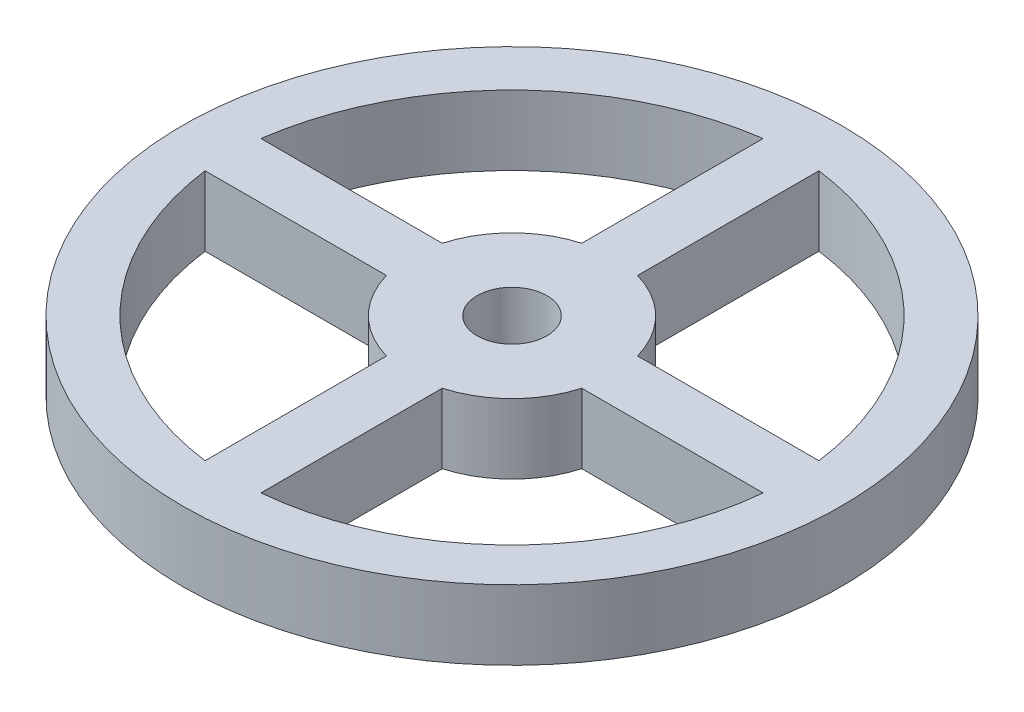
ISO-10303-21;
HEADER;
FILE_DESCRIPTION(('STEP AP214'),'2;1');
FILE_NAME('part.step','',(''),(''),'','','');
FILE_SCHEMA(('AUTOMOTIVE_DESIGN { 1 0 10303 214 1 1 1 1 }'));
ENDSEC;
DATA;
#1=APPLICATION_CONTEXT('core data for automotive mechanical design processes');
#2=APPLICATION_PROTOCOL_DEFINITION('international standard','automotive_design',2000,#1);
#3=PRODUCT_CONTEXT('',#1,'mechanical');
#4=PRODUCT('Part','Part','',(#3));
#5=PRODUCT_RELATED_PRODUCT_CATEGORY('part','',(#4));
#6=PRODUCT_DEFINITION_FORMATION('','',#4);
#7=PRODUCT_DEFINITION_CONTEXT('part definition',#1,'design');
#8=PRODUCT_DEFINITION('design','',#6,#7);
#9=PRODUCT_DEFINITION_SHAPE('','',#8);
#10=(LENGTH_UNIT() NAMED_UNIT(*) SI_UNIT(.MILLI.,.METRE.));
#11=(NAMED_UNIT(*) PLANE_ANGLE_UNIT() SI_UNIT($,.RADIAN.));
#12=(NAMED_UNIT(*) SI_UNIT($,.STERADIAN.) SOLID_ANGLE_UNIT());
#13=UNCERTAINTY_MEASURE_WITH_UNIT(LENGTH_MEASURE(1.E-05),#10,'distance_accuracy_value','');
#14=(GEOMETRIC_REPRESENTATION_CONTEXT(3) GLOBAL_UNCERTAINTY_ASSIGNED_CONTEXT((#13)) GLOBAL_UNIT_ASSIGNED_CONTEXT((#10,
#11,#12)) REPRESENTATION_CONTEXT('',''));
#15=CARTESIAN_POINT('',(0.,0.,0.));
#16=DIRECTION('',(0.,0.,1.));
#17=DIRECTION('',(1.,0.,0.));
#18=AXIS2_PLACEMENT_3D('',#15,#16,#17);
#19=CARTESIAN_POINT('',(0.,6.35,0.));
#20=DIRECTION('',(0.,-1.,0.));
#21=DIRECTION('',(0.,0.,-1.));
#22=AXIS2_PLACEMENT_3D('',#19,#20,#21);
#23=CYLINDRICAL_SURFACE('',#22,30.);
#24=CARTESIAN_POINT('',(0.,6.35,0.));
#25=DIRECTION('',(0.,1.,0.));
#26=DIRECTION('',(0.,0.,1.));
#27=AXIS2_PLACEMENT_3D('',#24,#25,#26);
#28=CIRCLE('',#27,30.);
#29=CARTESIAN_POINT('',(0.,6.35,30.));
#30=VERTEX_POINT('',#29);
#31=EDGE_CURVE('E11',#30,#30,#28,.T.);
#32=ORIENTED_EDGE('',*,*,#31,.F.);
#33=EDGE_LOOP('',(#32));
#34=FACE_BOUND('',#33,.T.);
#35=CARTESIAN_POINT('',(0.,0.,0.));
#36=DIRECTION('',(0.,1.,0.));
#37=DIRECTION('',(0.,0.,1.));
#38=AXIS2_PLACEMENT_3D('',#35,#36,#37);
#39=CIRCLE('',#38,30.);
#40=CARTESIAN_POINT('',(0.,0.,30.));
#41=VERTEX_POINT('',#40);
#42=EDGE_CURVE('E36',#41,#41,#39,.T.);
#43=ORIENTED_EDGE('',*,*,#42,.T.);
#44=EDGE_LOOP('',(#43));
#45=FACE_BOUND('',#44,.T.);
#46=ADVANCED_FACE('F33',(#34,#45),#23,.T.);
#47=CARTESIAN_POINT('',(0.,6.35,0.));
#48=DIRECTION('',(0.,1.,0.));
#49=DIRECTION('',(0.,0.,1.));
#50=AXIS2_PLACEMENT_3D('',#47,#48,#49);
#51=PLANE('',#50);
#52=CARTESIAN_POINT('',(-1.76941794549634E-13,6.35,1.76074432811646E-13));
#53=DIRECTION('',(0.,-1.,0.));
#54=DIRECTION('',(0.,0.,-1.));
#55=AXIS2_PLACEMENT_3D('',#52,#53,#54);
#56=CIRCLE('',#55,9.24573955938648);
#57=CARTESIAN_POINT('',(2.54,6.35,-8.89));
#58=VERTEX_POINT('',#57);
#59=CARTESIAN_POINT('',(8.89,6.35,-2.54));
#60=VERTEX_POINT('',#59);
#61=EDGE_CURVE('E47',#58,#60,#56,.T.);
#62=ORIENTED_EDGE('',*,*,#61,.F.);
#63=DIRECTION('',(0.,0.,1.));
#64=VECTOR('',#63,1.);
#65=CARTESIAN_POINT('',(2.54,6.35,-8.89));
#66=LINE('',#65,#64);
#67=CARTESIAN_POINT('',(2.54,6.35,-25.4));
#68=VERTEX_POINT('',#67);
#69=EDGE_CURVE('E224',#68,#58,#66,.T.);
#70=ORIENTED_EDGE('',*,*,#69,.F.);
#71=CARTESIAN_POINT('',(-0.945362098874315,6.35,0.945362098874315));
#72=DIRECTION('',(0.,1.,0.));
#73=DIRECTION('',(0.,0.,-1.));
#74=AXIS2_PLACEMENT_3D('',#71,#72,#73);
#75=CIRCLE('',#74,26.5749102177425);
#76=CARTESIAN_POINT('',(25.4,6.35,-2.54));
#77=VERTEX_POINT('',#76);
#78=EDGE_CURVE('E238',#77,#68,#75,.T.);
#79=ORIENTED_EDGE('',*,*,#78,.F.);
#80=DIRECTION('',(1.,0.,0.));
#81=VECTOR('',#80,1.);
#82=CARTESIAN_POINT('',(8.89,6.35,-2.54));
#83=LINE('',#82,#81);
#84=EDGE_CURVE('E235',#60,#77,#83,.T.);
#85=ORIENTED_EDGE('',*,*,#84,.F.);
#86=EDGE_LOOP('',(#62,#70,#79,#85));
#87=FACE_BOUND('',#86,.T.);
#88=CARTESIAN_POINT('',(0.,6.35,0.));
#89=DIRECTION('',(0.,-1.,0.));
#90=DIRECTION('',(0.,0.,-1.));
#91=AXIS2_PLACEMENT_3D('',#88,#89,#90);
#92=CIRCLE('',#91,9.2457395593863);
#93=CARTESIAN_POINT('',(-8.89,6.35,-2.54));
#94=VERTEX_POINT('',#93);
#95=CARTESIAN_POINT('',(-2.54,6.35,-8.89));
#96=VERTEX_POINT('',#95);
#97=EDGE_CURVE('E55',#94,#96,#92,.T.);
#98=ORIENTED_EDGE('',*,*,#97,.F.);
#99=DIRECTION('',(1.,0.,0.));
#100=VECTOR('',#99,1.);
#101=CARTESIAN_POINT('',(-8.89,6.35,-2.54));
#102=LINE('',#101,#100);
#103=CARTESIAN_POINT('',(-25.4,6.35,-2.54));
#104=VERTEX_POINT('',#103);
#105=EDGE_CURVE('E194',#104,#94,#102,.T.);
#106=ORIENTED_EDGE('',*,*,#105,.F.);
#107=CARTESIAN_POINT('',(1.19938539126162,6.35,1.19938539126162));
#108=DIRECTION('',(0.,1.,0.));
#109=DIRECTION('',(0.,0.,-1.));
#110=AXIS2_PLACEMENT_3D('',#107,#108,#109);
#111=CIRCLE('',#110,26.8609438832153);
#112=CARTESIAN_POINT('',(-2.54,6.35,-25.4));
#113=VERTEX_POINT('',#112);
#114=EDGE_CURVE('E209',#113,#104,#111,.T.);
#115=ORIENTED_EDGE('',*,*,#114,.F.);
#116=DIRECTION('',(0.,0.,-1.));
#117=VECTOR('',#116,1.);
#118=CARTESIAN_POINT('',(-2.54,6.35,-8.89));
#119=LINE('',#118,#117);
#120=EDGE_CURVE('E205',#96,#113,#119,.T.);
#121=ORIENTED_EDGE('',*,*,#120,.F.);
#122=EDGE_LOOP('',(#98,#106,#115,#121));
#123=FACE_BOUND('',#122,.T.);
#124=CARTESIAN_POINT('',(1.98625837999344E-13,6.35,-1.97758476261356E-13));
#125=DIRECTION('',(0.,-1.,0.));
#126=DIRECTION('',(0.,0.,-1.));
#127=AXIS2_PLACEMENT_3D('',#124,#125,#126);
#128=CIRCLE('',#127,9.2457395593865);
#129=CARTESIAN_POINT('',(-2.54,6.35,8.89));
#130=VERTEX_POINT('',#129);
#131=CARTESIAN_POINT('',(-8.89,6.35,2.54));
#132=VERTEX_POINT('',#131);
#133=EDGE_CURVE('E152',#130,#132,#128,.T.);
#134=ORIENTED_EDGE('',*,*,#133,.F.);
#135=DIRECTION('',(0.,0.,-1.));
#136=VECTOR('',#135,1.);
#137=CARTESIAN_POINT('',(-2.54,6.35,8.89));
#138=LINE('',#137,#136);
#139=CARTESIAN_POINT('',(-2.54,6.35,25.4));
#140=VERTEX_POINT('',#139);
#141=EDGE_CURVE('E170',#140,#130,#138,.T.);
#142=ORIENTED_EDGE('',*,*,#141,.F.);
#143=CARTESIAN_POINT('',(0.94536209887696,6.35,-0.94536209887696));
#144=DIRECTION('',(0.,1.,0.));
#145=DIRECTION('',(0.,0.,-1.));
#146=AXIS2_PLACEMENT_3D('',#143,#144,#145);
#147=CIRCLE('',#146,26.5749102177454);
#148=CARTESIAN_POINT('',(-25.4,6.35,2.54000000000002));
#149=VERTEX_POINT('',#148);
#150=EDGE_CURVE('E173',#149,#140,#147,.T.);
#151=ORIENTED_EDGE('',*,*,#150,.F.);
#152=DIRECTION('',(-1.,0.,0.));
#153=VECTOR('',#152,1.);
#154=CARTESIAN_POINT('',(-8.89,6.35,2.54));
#155=LINE('',#154,#153);
#156=EDGE_CURVE('E179',#132,#149,#155,.T.);
#157=ORIENTED_EDGE('',*,*,#156,.F.);
#158=EDGE_LOOP('',(#134,#142,#151,#157));
#159=FACE_BOUND('',#158,.T.);
#160=CARTESIAN_POINT('',(-2.62810606610486E-13,6.35,-2.63677968348475E-13));
#161=DIRECTION('',(0.,-1.,0.));
#162=DIRECTION('',(0.,0.,-1.));
#163=AXIS2_PLACEMENT_3D('',#160,#161,#162);
#164=CIRCLE('',#163,9.24573955938658);
#165=CARTESIAN_POINT('',(8.89,6.35,2.54));
#166=VERTEX_POINT('',#165);
#167=CARTESIAN_POINT('',(2.54,6.35,8.89));
#168=VERTEX_POINT('',#167);
#169=EDGE_CURVE('E186',#166,#168,#164,.T.);
#170=ORIENTED_EDGE('',*,*,#169,.F.);
#171=DIRECTION('',(-1.,0.,0.));
#172=VECTOR('',#171,1.);
#173=CARTESIAN_POINT('',(8.89,6.35,2.54));
#174=LINE('',#173,#172);
#175=CARTESIAN_POINT('',(25.4,6.35,2.54));
#176=VERTEX_POINT('',#175);
#177=EDGE_CURVE('E253',#176,#166,#174,.T.);
#178=ORIENTED_EDGE('',*,*,#177,.F.);
#179=CARTESIAN_POINT('',(0.115935614412643,6.35,0.115935614412643));
#180=DIRECTION('',(0.,1.,0.));
#181=DIRECTION('',(0.,0.,1.));
#182=AXIS2_PLACEMENT_3D('',#179,#180,#181);
#183=CIRCLE('',#182,25.4);
#184=CARTESIAN_POINT('',(2.54,6.35,25.4));
#185=VERTEX_POINT('',#184);
#186=EDGE_CURVE('E267',#185,#176,#183,.T.);
#187=ORIENTED_EDGE('',*,*,#186,.F.);
#188=DIRECTION('',(0.,0.,1.));
#189=VECTOR('',#188,1.);
#190=CARTESIAN_POINT('',(2.54,6.35,8.89));
#191=LINE('',#190,#189);
#192=EDGE_CURVE('E264',#168,#185,#191,.T.);
#193=ORIENTED_EDGE('',*,*,#192,.F.);
#194=EDGE_LOOP('',(#170,#178,#187,#193));
#195=FACE_BOUND('',#194,.T.);
#196=CARTESIAN_POINT('',(0.,6.35,0.));
#197=DIRECTION('',(0.,1.,0.));
#198=DIRECTION('',(0.,0.,1.));
#199=AXIS2_PLACEMENT_3D('',#196,#197,#198);
#200=CIRCLE('',#199,3.175);
#201=CARTESIAN_POINT('',(0.,6.35,3.175));
#202=VERTEX_POINT('',#201);
#203=EDGE_CURVE('E274',#202,#202,#200,.T.);
#204=ORIENTED_EDGE('',*,*,#203,.F.);
#205=EDGE_LOOP('',(#204));
#206=FACE_BOUND('',#205,.T.);
#207=ORIENTED_EDGE('',*,*,#31,.T.);
#208=EDGE_LOOP('',(#207));
#209=FACE_BOUND('',#208,.T.);
#210=ADVANCED_FACE('F289',(#87,#123,#159,#195,#206,#209),#51,.T.);
#211=CARTESIAN_POINT('',(0.,0.,0.));
#212=DIRECTION('',(0.,1.,0.));
#213=DIRECTION('',(0.,0.,1.));
#214=AXIS2_PLACEMENT_3D('',#211,#212,#213);
#215=PLANE('',#214);
#216=DIRECTION('',(0.,0.,1.));
#217=VECTOR('',#216,1.);
#218=CARTESIAN_POINT('',(2.54,0.,-8.89));
#219=LINE('',#218,#217);
#220=CARTESIAN_POINT('',(2.54,0.,-25.4));
#221=VERTEX_POINT('',#220);
#222=CARTESIAN_POINT('',(2.54,0.,-8.89));
#223=VERTEX_POINT('',#222);
#224=EDGE_CURVE('E230',#221,#223,#219,.T.);
#225=ORIENTED_EDGE('',*,*,#224,.T.);
#226=CARTESIAN_POINT('',(-1.76941794549634E-13,0.,1.76074432811646E-13));
#227=DIRECTION('',(0.,-1.,0.));
#228=DIRECTION('',(0.,0.,-1.));
#229=AXIS2_PLACEMENT_3D('',#226,#227,#228);
#230=CIRCLE('',#229,9.24573955938648);
#231=CARTESIAN_POINT('',(8.89,0.,-2.54));
#232=VERTEX_POINT('',#231);
#233=EDGE_CURVE('E220',#223,#232,#230,.T.);
#234=ORIENTED_EDGE('',*,*,#233,.T.);
#235=DIRECTION('',(1.,0.,0.));
#236=VECTOR('',#235,1.);
#237=CARTESIAN_POINT('',(8.89,0.,-2.54));
#238=LINE('',#237,#236);
#239=CARTESIAN_POINT('',(25.4,0.,-2.54));
#240=VERTEX_POINT('',#239);
#241=EDGE_CURVE('E223',#232,#240,#238,.T.);
#242=ORIENTED_EDGE('',*,*,#241,.T.);
#243=CARTESIAN_POINT('',(-0.945362098874315,0.,0.945362098874315));
#244=DIRECTION('',(0.,1.,0.));
#245=DIRECTION('',(0.,0.,-1.));
#246=AXIS2_PLACEMENT_3D('',#243,#244,#245);
#247=CIRCLE('',#246,26.5749102177425);
#248=EDGE_CURVE('E227',#240,#221,#247,.T.);
#249=ORIENTED_EDGE('',*,*,#248,.T.);
#250=EDGE_LOOP('',(#225,#234,#242,#249));
#251=FACE_BOUND('',#250,.T.);
#252=DIRECTION('',(1.,0.,0.));
#253=VECTOR('',#252,1.);
#254=CARTESIAN_POINT('',(-8.89,0.,-2.54));
#255=LINE('',#254,#253);
#256=CARTESIAN_POINT('',(-25.4,0.,-2.54));
#257=VERTEX_POINT('',#256);
#258=CARTESIAN_POINT('',(-8.89,0.,-2.54));
#259=VERTEX_POINT('',#258);
#260=EDGE_CURVE('E200',#257,#259,#255,.T.);
#261=ORIENTED_EDGE('',*,*,#260,.T.);
#262=CARTESIAN_POINT('',(0.,0.,0.));
#263=DIRECTION('',(0.,-1.,0.));
#264=DIRECTION('',(0.,0.,-1.));
#265=AXIS2_PLACEMENT_3D('',#262,#263,#264);
#266=CIRCLE('',#265,9.2457395593863);
#267=CARTESIAN_POINT('',(-2.54,0.,-8.89));
#268=VERTEX_POINT('',#267);
#269=EDGE_CURVE('E190',#259,#268,#266,.T.);
#270=ORIENTED_EDGE('',*,*,#269,.T.);
#271=DIRECTION('',(0.,0.,-1.));
#272=VECTOR('',#271,1.);
#273=CARTESIAN_POINT('',(-2.54,0.,-8.89));
#274=LINE('',#273,#272);
#275=CARTESIAN_POINT('',(-2.54,0.,-25.4));
#276=VERTEX_POINT('',#275);
#277=EDGE_CURVE('E193',#268,#276,#274,.T.);
#278=ORIENTED_EDGE('',*,*,#277,.T.);
#279=CARTESIAN_POINT('',(1.19938539126162,0.,1.19938539126162));
#280=DIRECTION('',(0.,1.,0.));
#281=DIRECTION('',(0.,0.,-1.));
#282=AXIS2_PLACEMENT_3D('',#279,#280,#281);
#283=CIRCLE('',#282,26.8609438832153);
#284=EDGE_CURVE('E197',#276,#257,#283,.T.);
#285=ORIENTED_EDGE('',*,*,#284,.T.);
#286=EDGE_LOOP('',(#261,#270,#278,#285));
#287=FACE_BOUND('',#286,.T.);
#288=DIRECTION('',(0.,0.,-1.));
#289=VECTOR('',#288,1.);
#290=CARTESIAN_POINT('',(-2.54,0.,8.89));
#291=LINE('',#290,#289);
#292=CARTESIAN_POINT('',(-2.54,0.,25.4));
#293=VERTEX_POINT('',#292);
#294=CARTESIAN_POINT('',(-2.54,0.,8.89));
#295=VERTEX_POINT('',#294);
#296=EDGE_CURVE('E157',#293,#295,#291,.T.);
#297=ORIENTED_EDGE('',*,*,#296,.T.);
#298=CARTESIAN_POINT('',(1.98625837999344E-13,0.,-1.97758476261356E-13));
#299=DIRECTION('',(0.,-1.,0.));
#300=DIRECTION('',(0.,0.,-1.));
#301=AXIS2_PLACEMENT_3D('',#298,#299,#300);
#302=CIRCLE('',#301,9.2457395593865);
#303=CARTESIAN_POINT('',(-8.89,0.,2.54));
#304=VERTEX_POINT('',#303);
#305=EDGE_CURVE('E149',#295,#304,#302,.T.);
#306=ORIENTED_EDGE('',*,*,#305,.T.);
#307=DIRECTION('',(-1.,0.,0.));
#308=VECTOR('',#307,1.);
#309=CARTESIAN_POINT('',(-8.89,0.,2.54));
#310=LINE('',#309,#308);
#311=CARTESIAN_POINT('',(-25.4,0.,2.54));
#312=VERTEX_POINT('',#311);
#313=EDGE_CURVE('E161',#304,#312,#310,.T.);
#314=ORIENTED_EDGE('',*,*,#313,.T.);
#315=CARTESIAN_POINT('',(0.94536209887696,0.,-0.94536209887696));
#316=DIRECTION('',(0.,1.,0.));
#317=DIRECTION('',(0.,0.,-1.));
#318=AXIS2_PLACEMENT_3D('',#315,#316,#317);
#319=CIRCLE('',#318,26.5749102177454);
#320=EDGE_CURVE('E165',#312,#293,#319,.T.);
#321=ORIENTED_EDGE('',*,*,#320,.T.);
#322=EDGE_LOOP('',(#297,#306,#314,#321));
#323=FACE_BOUND('',#322,.T.);
#324=DIRECTION('',(-1.,0.,0.));
#325=VECTOR('',#324,1.);
#326=CARTESIAN_POINT('',(8.89,0.,2.54));
#327=LINE('',#326,#325);
#328=CARTESIAN_POINT('',(25.4,0.,2.54));
#329=VERTEX_POINT('',#328);
#330=CARTESIAN_POINT('',(8.89,0.,2.54));
#331=VERTEX_POINT('',#330);
#332=EDGE_CURVE('E259',#329,#331,#327,.T.);
#333=ORIENTED_EDGE('',*,*,#332,.T.);
#334=CARTESIAN_POINT('',(-2.62810606610486E-13,0.,-2.63677968348475E-13));
#335=DIRECTION('',(0.,-1.,0.));
#336=DIRECTION('',(0.,0.,-1.));
#337=AXIS2_PLACEMENT_3D('',#334,#335,#336);
#338=CIRCLE('',#337,9.24573955938658);
#339=CARTESIAN_POINT('',(2.54,0.,8.89));
#340=VERTEX_POINT('',#339);
#341=EDGE_CURVE('E249',#331,#340,#338,.T.);
#342=ORIENTED_EDGE('',*,*,#341,.T.);
#343=DIRECTION('',(0.,0.,1.));
#344=VECTOR('',#343,1.);
#345=CARTESIAN_POINT('',(2.54,0.,8.89));
#346=LINE('',#345,#344);
#347=CARTESIAN_POINT('',(2.54,0.,25.4));
#348=VERTEX_POINT('',#347);
#349=EDGE_CURVE('E252',#340,#348,#346,.T.);
#350=ORIENTED_EDGE('',*,*,#349,.T.);
#351=CARTESIAN_POINT('',(0.115935614412643,0.,0.115935614412643));
#352=DIRECTION('',(0.,1.,0.));
#353=DIRECTION('',(0.,0.,1.));
#354=AXIS2_PLACEMENT_3D('',#351,#352,#353);
#355=CIRCLE('',#354,25.4);
#356=EDGE_CURVE('E256',#348,#329,#355,.T.);
#357=ORIENTED_EDGE('',*,*,#356,.T.);
#358=EDGE_LOOP('',(#333,#342,#350,#357));
#359=FACE_BOUND('',#358,.T.);
#360=CARTESIAN_POINT('',(0.,0.,0.));
#361=DIRECTION('',(0.,1.,0.));
#362=DIRECTION('',(0.,0.,1.));
#363=AXIS2_PLACEMENT_3D('',#360,#361,#362);
#364=CIRCLE('',#363,3.175);
#365=CARTESIAN_POINT('',(0.,0.,3.175));
#366=VERTEX_POINT('',#365);
#367=EDGE_CURVE('E281',#366,#366,#364,.T.);
#368=ORIENTED_EDGE('',*,*,#367,.T.);
#369=EDGE_LOOP('',(#368));
#370=FACE_BOUND('',#369,.T.);
#371=ORIENTED_EDGE('',*,*,#42,.F.);
#372=EDGE_LOOP('',(#371));
#373=FACE_BOUND('',#372,.T.);
#374=ADVANCED_FACE('F167',(#251,#287,#323,#359,#370,#373),#215,.F.);
#375=CARTESIAN_POINT('',(0.,0.,0.));
#376=DIRECTION('',(0.,1.,0.));
#377=DIRECTION('',(0.,0.,1.));
#378=AXIS2_PLACEMENT_3D('',#375,#376,#377);
#379=CYLINDRICAL_SURFACE('',#378,3.175);
#380=ORIENTED_EDGE('',*,*,#367,.F.);
#381=EDGE_LOOP('',(#380));
#382=FACE_BOUND('',#381,.T.);
#383=ORIENTED_EDGE('',*,*,#203,.T.);
#384=EDGE_LOOP('',(#383));
#385=FACE_BOUND('',#384,.T.);
#386=ADVANCED_FACE('F287',(#382,#385),#379,.F.);
#387=CARTESIAN_POINT('',(-2.62810606610486E-13,0.,-2.63677968348475E-13));
#388=DIRECTION('',(0.,1.,0.));
#389=DIRECTION('',(0.,0.,1.));
#390=AXIS2_PLACEMENT_3D('',#387,#388,#389);
#391=CYLINDRICAL_SURFACE('',#390,9.24573955938658);
#392=ORIENTED_EDGE('',*,*,#169,.T.);
#393=DIRECTION('',(0.,1.,0.));
#394=VECTOR('',#393,1.);
#395=CARTESIAN_POINT('',(2.54,0.,8.89));
#396=LINE('',#395,#394);
#397=EDGE_CURVE('E262',#340,#168,#396,.T.);
#398=ORIENTED_EDGE('',*,*,#397,.F.);
#399=ORIENTED_EDGE('',*,*,#341,.F.);
#400=DIRECTION('',(0.,1.,0.));
#401=VECTOR('',#400,1.);
#402=CARTESIAN_POINT('',(8.89,0.,2.54));
#403=LINE('',#402,#401);
#404=EDGE_CURVE('E272',#331,#166,#403,.T.);
#405=ORIENTED_EDGE('',*,*,#404,.T.);
#406=EDGE_LOOP('',(#392,#398,#399,#405));
#407=FACE_BOUND('',#406,.T.);
#408=ADVANCED_FACE('F306',(#407),#391,.T.);
#409=CARTESIAN_POINT('',(8.89,0.,2.54));
#410=DIRECTION('',(0.,0.,-1.));
#411=DIRECTION('',(-1.,0.,0.));
#412=AXIS2_PLACEMENT_3D('',#409,#410,#411);
#413=PLANE('',#412);
#414=ORIENTED_EDGE('',*,*,#177,.T.);
#415=ORIENTED_EDGE('',*,*,#404,.F.);
#416=ORIENTED_EDGE('',*,*,#332,.F.);
#417=DIRECTION('',(0.,1.,0.));
#418=VECTOR('',#417,1.);
#419=CARTESIAN_POINT('',(25.4,0.,2.54));
#420=LINE('',#419,#418);
#421=EDGE_CURVE('E275',#329,#176,#420,.T.);
#422=ORIENTED_EDGE('',*,*,#421,.T.);
#423=EDGE_LOOP('',(#414,#415,#416,#422));
#424=FACE_BOUND('',#423,.T.);
#425=ADVANCED_FACE('F313',(#424),#413,.F.);
#426=CARTESIAN_POINT('',(0.115935614412643,0.,0.115935614412643));
#427=DIRECTION('',(0.,1.,0.));
#428=DIRECTION('',(0.,0.,1.));
#429=AXIS2_PLACEMENT_3D('',#426,#427,#428);
#430=CYLINDRICAL_SURFACE('',#429,25.4);
#431=ORIENTED_EDGE('',*,*,#186,.T.);
#432=ORIENTED_EDGE('',*,*,#421,.F.);
#433=ORIENTED_EDGE('',*,*,#356,.F.);
#434=DIRECTION('',(0.,1.,0.));
#435=VECTOR('',#434,1.);
#436=CARTESIAN_POINT('',(2.54,0.,25.4));
#437=LINE('',#436,#435);
#438=EDGE_CURVE('E277',#348,#185,#437,.T.);
#439=ORIENTED_EDGE('',*,*,#438,.T.);
#440=EDGE_LOOP('',(#431,#432,#433,#439));
#441=FACE_BOUND('',#440,.T.);
#442=ADVANCED_FACE('F318',(#441),#430,.F.);
#443=CARTESIAN_POINT('',(2.54,0.,8.89));
#444=DIRECTION('',(-1.,0.,0.));
#445=DIRECTION('',(0.,0.,1.));
#446=AXIS2_PLACEMENT_3D('',#443,#444,#445);
#447=PLANE('',#446);
#448=ORIENTED_EDGE('',*,*,#192,.T.);
#449=ORIENTED_EDGE('',*,*,#438,.F.);
#450=ORIENTED_EDGE('',*,*,#349,.F.);
#451=ORIENTED_EDGE('',*,*,#397,.T.);
#452=EDGE_LOOP('',(#448,#449,#450,#451));
#453=FACE_BOUND('',#452,.T.);
#454=ADVANCED_FACE('F315',(#453),#447,.F.);
#455=CARTESIAN_POINT('',(1.98625837999344E-13,0.,-1.97758476261356E-13));
#456=DIRECTION('',(0.,1.,0.));
#457=DIRECTION('',(0.,0.,1.));
#458=AXIS2_PLACEMENT_3D('',#455,#456,#457);
#459=CYLINDRICAL_SURFACE('',#458,9.2457395593865);
#460=ORIENTED_EDGE('',*,*,#133,.T.);
#461=DIRECTION('',(0.,1.,0.));
#462=VECTOR('',#461,1.);
#463=CARTESIAN_POINT('',(-8.89,0.,2.54));
#464=LINE('',#463,#462);
#465=EDGE_CURVE('E145',#304,#132,#464,.T.);
#466=ORIENTED_EDGE('',*,*,#465,.F.);
#467=ORIENTED_EDGE('',*,*,#305,.F.);
#468=DIRECTION('',(0.,1.,0.));
#469=VECTOR('',#468,1.);
#470=CARTESIAN_POINT('',(-2.54,0.,8.89));
#471=LINE('',#470,#469);
#472=EDGE_CURVE('E184',#295,#130,#471,.T.);
#473=ORIENTED_EDGE('',*,*,#472,.T.);
#474=EDGE_LOOP('',(#460,#466,#467,#473));
#475=FACE_BOUND('',#474,.T.);
#476=ADVANCED_FACE('F147',(#475),#459,.T.);
#477=CARTESIAN_POINT('',(-2.54,0.,8.89));
#478=DIRECTION('',(1.,0.,0.));
#479=DIRECTION('',(0.,0.,-1.));
#480=AXIS2_PLACEMENT_3D('',#477,#478,#479);
#481=PLANE('',#480);
#482=ORIENTED_EDGE('',*,*,#141,.T.);
#483=ORIENTED_EDGE('',*,*,#472,.F.);
#484=ORIENTED_EDGE('',*,*,#296,.F.);
#485=DIRECTION('',(0.,1.,0.));
#486=VECTOR('',#485,1.);
#487=CARTESIAN_POINT('',(-2.54,0.,25.4));
#488=LINE('',#487,#486);
#489=EDGE_CURVE('E187',#293,#140,#488,.T.);
#490=ORIENTED_EDGE('',*,*,#489,.T.);
#491=EDGE_LOOP('',(#482,#483,#484,#490));
#492=FACE_BOUND('',#491,.T.);
#493=ADVANCED_FACE('F358',(#492),#481,.F.);
#494=CARTESIAN_POINT('',(0.94536209887696,0.,-0.94536209887696));
#495=DIRECTION('',(0.,1.,0.));
#496=DIRECTION('',(0.,0.,1.));
#497=AXIS2_PLACEMENT_3D('',#494,#495,#496);
#498=CYLINDRICAL_SURFACE('',#497,26.5749102177454);
#499=ORIENTED_EDGE('',*,*,#150,.T.);
#500=ORIENTED_EDGE('',*,*,#489,.F.);
#501=ORIENTED_EDGE('',*,*,#320,.F.);
#502=DIRECTION('',(0.,1.,0.));
#503=VECTOR('',#502,1.);
#504=CARTESIAN_POINT('',(-25.4,0.,2.54000000000002));
#505=LINE('',#504,#503);
#506=EDGE_CURVE('E156',#312,#149,#505,.T.);
#507=ORIENTED_EDGE('',*,*,#506,.T.);
#508=EDGE_LOOP('',(#499,#500,#501,#507));
#509=FACE_BOUND('',#508,.T.);
#510=ADVANCED_FACE('F361',(#509),#498,.F.);
#511=CARTESIAN_POINT('',(-8.89,0.,2.54));
#512=DIRECTION('',(0.,0.,-1.));
#513=DIRECTION('',(-1.,0.,0.));
#514=AXIS2_PLACEMENT_3D('',#511,#512,#513);
#515=PLANE('',#514);
#516=ORIENTED_EDGE('',*,*,#156,.T.);
#517=ORIENTED_EDGE('',*,*,#506,.F.);
#518=ORIENTED_EDGE('',*,*,#313,.F.);
#519=ORIENTED_EDGE('',*,*,#465,.T.);
#520=EDGE_LOOP('',(#516,#517,#518,#519));
#521=FACE_BOUND('',#520,.T.);
#522=ADVANCED_FACE('F162',(#521),#515,.F.);
#523=CARTESIAN_POINT('',(0.,0.,0.));
#524=DIRECTION('',(0.,1.,0.));
#525=DIRECTION('',(0.,0.,1.));
#526=AXIS2_PLACEMENT_3D('',#523,#524,#525);
#527=CYLINDRICAL_SURFACE('',#526,9.2457395593863);
#528=ORIENTED_EDGE('',*,*,#97,.T.);
#529=DIRECTION('',(0.,1.,0.));
#530=VECTOR('',#529,1.);
#531=CARTESIAN_POINT('',(-2.54,0.,-8.89));
#532=LINE('',#531,#530);
#533=EDGE_CURVE('E203',#268,#96,#532,.T.);
#534=ORIENTED_EDGE('',*,*,#533,.F.);
#535=ORIENTED_EDGE('',*,*,#269,.F.);
#536=DIRECTION('',(0.,1.,0.));
#537=VECTOR('',#536,1.);
#538=CARTESIAN_POINT('',(-8.89,0.,-2.54));
#539=LINE('',#538,#537);
#540=EDGE_CURVE('E180',#259,#94,#539,.T.);
#541=ORIENTED_EDGE('',*,*,#540,.T.);
#542=EDGE_LOOP('',(#528,#534,#535,#541));
#543=FACE_BOUND('',#542,.T.);
#544=ADVANCED_FACE('F342',(#543),#527,.T.);
#545=CARTESIAN_POINT('',(-8.89,0.,-2.54));
#546=DIRECTION('',(0.,0.,1.));
#547=DIRECTION('',(1.,0.,0.));
#548=AXIS2_PLACEMENT_3D('',#545,#546,#547);
#549=PLANE('',#548);
#550=ORIENTED_EDGE('',*,*,#105,.T.);
#551=ORIENTED_EDGE('',*,*,#540,.F.);
#552=ORIENTED_EDGE('',*,*,#260,.F.);
#553=DIRECTION('',(0.,1.,0.));
#554=VECTOR('',#553,1.);
#555=CARTESIAN_POINT('',(-25.4,0.,-2.54));
#556=LINE('',#555,#554);
#557=EDGE_CURVE('E215',#257,#104,#556,.T.);
#558=ORIENTED_EDGE('',*,*,#557,.T.);
#559=EDGE_LOOP('',(#550,#551,#552,#558));
#560=FACE_BOUND('',#559,.T.);
#561=ADVANCED_FACE('F345',(#560),#549,.F.);
#562=CARTESIAN_POINT('',(1.19938539126162,0.,1.19938539126162));
#563=DIRECTION('',(0.,1.,0.));
#564=DIRECTION('',(0.,0.,1.));
#565=AXIS2_PLACEMENT_3D('',#562,#563,#564);
#566=CYLINDRICAL_SURFACE('',#565,26.8609438832153);
#567=ORIENTED_EDGE('',*,*,#114,.T.);
#568=ORIENTED_EDGE('',*,*,#557,.F.);
#569=ORIENTED_EDGE('',*,*,#284,.F.);
#570=DIRECTION('',(0.,1.,0.));
#571=VECTOR('',#570,1.);
#572=CARTESIAN_POINT('',(-2.54,0.,-25.4));
#573=LINE('',#572,#571);
#574=EDGE_CURVE('E217',#276,#113,#573,.T.);
#575=ORIENTED_EDGE('',*,*,#574,.T.);
#576=EDGE_LOOP('',(#567,#568,#569,#575));
#577=FACE_BOUND('',#576,.T.);
#578=ADVANCED_FACE('F348',(#577),#566,.F.);
#579=CARTESIAN_POINT('',(-2.54,0.,-8.89));
#580=DIRECTION('',(1.,0.,0.));
#581=DIRECTION('',(0.,0.,-1.));
#582=AXIS2_PLACEMENT_3D('',#579,#580,#581);
#583=PLANE('',#582);
#584=ORIENTED_EDGE('',*,*,#120,.T.);
#585=ORIENTED_EDGE('',*,*,#574,.F.);
#586=ORIENTED_EDGE('',*,*,#277,.F.);
#587=ORIENTED_EDGE('',*,*,#533,.T.);
#588=EDGE_LOOP('',(#584,#585,#586,#587));
#589=FACE_BOUND('',#588,.T.);
#590=ADVANCED_FACE('F330',(#589),#583,.F.);
#591=CARTESIAN_POINT('',(-1.76941794549634E-13,0.,1.76074432811646E-13));
#592=DIRECTION('',(0.,1.,0.));
#593=DIRECTION('',(0.,0.,1.));
#594=AXIS2_PLACEMENT_3D('',#591,#592,#593);
#595=CYLINDRICAL_SURFACE('',#594,9.24573955938648);
#596=ORIENTED_EDGE('',*,*,#61,.T.);
#597=DIRECTION('',(0.,1.,0.));
#598=VECTOR('',#597,1.);
#599=CARTESIAN_POINT('',(8.89,0.,-2.54));
#600=LINE('',#599,#598);
#601=EDGE_CURVE('E233',#232,#60,#600,.T.);
#602=ORIENTED_EDGE('',*,*,#601,.F.);
#603=ORIENTED_EDGE('',*,*,#233,.F.);
#604=DIRECTION('',(0.,1.,0.));
#605=VECTOR('',#604,1.);
#606=CARTESIAN_POINT('',(2.54,0.,-8.89));
#607=LINE('',#606,#605);
#608=EDGE_CURVE('E206',#223,#58,#607,.T.);
#609=ORIENTED_EDGE('',*,*,#608,.T.);
#610=EDGE_LOOP('',(#596,#602,#603,#609));
#611=FACE_BOUND('',#610,.T.);
#612=ADVANCED_FACE('F326',(#611),#595,.T.);
#613=CARTESIAN_POINT('',(2.54,0.,-8.89));
#614=DIRECTION('',(-1.,0.,0.));
#615=DIRECTION('',(0.,0.,1.));
#616=AXIS2_PLACEMENT_3D('',#613,#614,#615);
#617=PLANE('',#616);
#618=ORIENTED_EDGE('',*,*,#69,.T.);
#619=ORIENTED_EDGE('',*,*,#608,.F.);
#620=ORIENTED_EDGE('',*,*,#224,.F.);
#621=DIRECTION('',(0.,1.,0.));
#622=VECTOR('',#621,1.);
#623=CARTESIAN_POINT('',(2.54,0.,-25.4));
#624=LINE('',#623,#622);
#625=EDGE_CURVE('E244',#221,#68,#624,.T.);
#626=ORIENTED_EDGE('',*,*,#625,.T.);
#627=EDGE_LOOP('',(#618,#619,#620,#626));
#628=FACE_BOUND('',#627,.T.);
#629=ADVANCED_FACE('F329',(#628),#617,.F.);
#630=CARTESIAN_POINT('',(-0.945362098874315,0.,0.945362098874315));
#631=DIRECTION('',(0.,1.,0.));
#632=DIRECTION('',(0.,0.,1.));
#633=AXIS2_PLACEMENT_3D('',#630,#631,#632);
#634=CYLINDRICAL_SURFACE('',#633,26.5749102177425);
#635=ORIENTED_EDGE('',*,*,#78,.T.);
#636=ORIENTED_EDGE('',*,*,#625,.F.);
#637=ORIENTED_EDGE('',*,*,#248,.F.);
#638=DIRECTION('',(0.,1.,0.));
#639=VECTOR('',#638,1.);
#640=CARTESIAN_POINT('',(25.4,0.,-2.54));
#641=LINE('',#640,#639);
#642=EDGE_CURVE('E246',#240,#77,#641,.T.);
#643=ORIENTED_EDGE('',*,*,#642,.T.);
#644=EDGE_LOOP('',(#635,#636,#637,#643));
#645=FACE_BOUND('',#644,.T.);
#646=ADVANCED_FACE('F334',(#645),#634,.F.);
#647=CARTESIAN_POINT('',(8.89,0.,-2.54));
#648=DIRECTION('',(0.,0.,1.));
#649=DIRECTION('',(1.,0.,0.));
#650=AXIS2_PLACEMENT_3D('',#647,#648,#649);
#651=PLANE('',#650);
#652=ORIENTED_EDGE('',*,*,#84,.T.);
#653=ORIENTED_EDGE('',*,*,#642,.F.);
#654=ORIENTED_EDGE('',*,*,#241,.F.);
#655=ORIENTED_EDGE('',*,*,#601,.T.);
#656=EDGE_LOOP('',(#652,#653,#654,#655));
#657=FACE_BOUND('',#656,.T.);
#658=ADVANCED_FACE('F331',(#657),#651,.F.);
#659=CLOSED_SHELL('',(#46,#210,#374,#386,#408,#425,#442,#454,#476,#493,#510,#522,#544,#561,#578,
#590,#612,#629,#646,#658));
#660=MANIFOLD_SOLID_BREP('B2',#659);
#661=ADVANCED_BREP_SHAPE_REPRESENTATION('',(#18,#660),#14);
#662=SHAPE_DEFINITION_REPRESENTATION(#9,#661);
ENDSEC;
END-ISO-10303-21;
